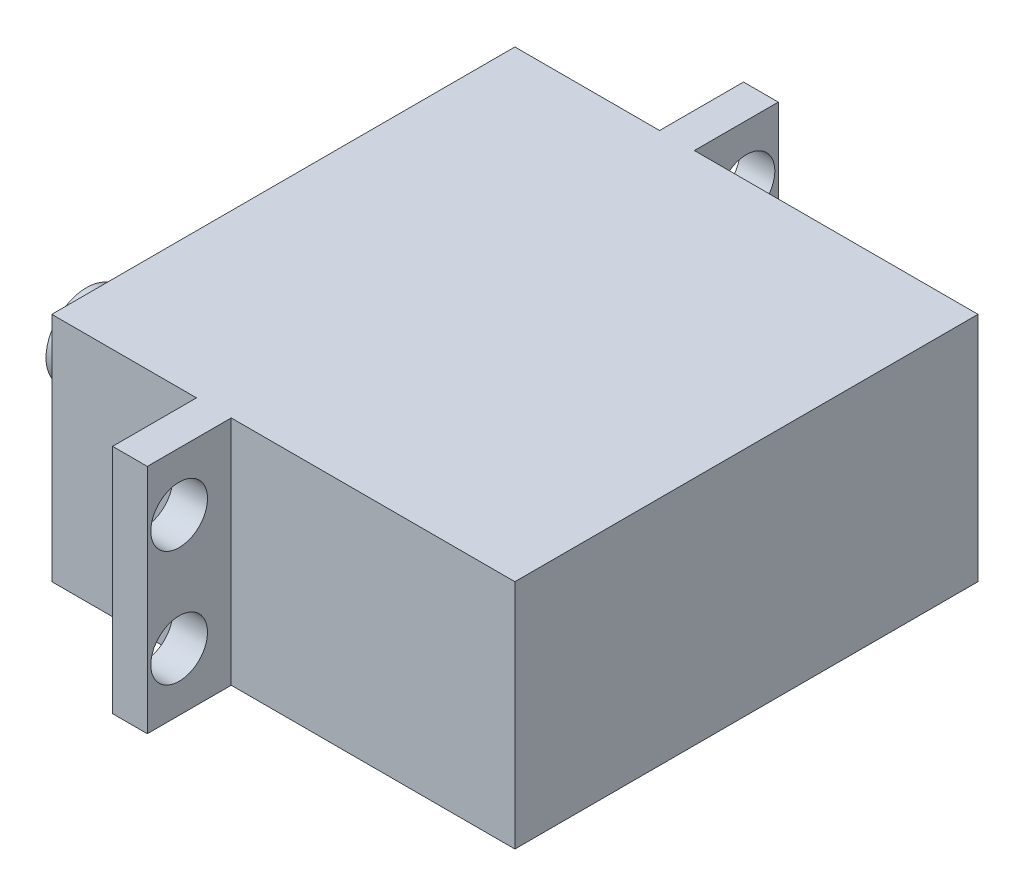
ISO-10303-21;
HEADER;
FILE_DESCRIPTION(('STEP AP214'),'2;1');
FILE_NAME('part.step','',(''),(''),'','','');
FILE_SCHEMA(('AUTOMOTIVE_DESIGN { 1 0 10303 214 1 1 1 1 }'));
ENDSEC;
DATA;
#1=APPLICATION_CONTEXT('core data for automotive mechanical design processes');
#2=APPLICATION_PROTOCOL_DEFINITION('international standard','automotive_design',2000,#1);
#3=PRODUCT_CONTEXT('',#1,'mechanical');
#4=PRODUCT('Part','Part','',(#3));
#5=PRODUCT_RELATED_PRODUCT_CATEGORY('part','',(#4));
#6=PRODUCT_DEFINITION_FORMATION('','',#4);
#7=PRODUCT_DEFINITION_CONTEXT('part definition',#1,'design');
#8=PRODUCT_DEFINITION('design','',#6,#7);
#9=PRODUCT_DEFINITION_SHAPE('','',#8);
#10=(LENGTH_UNIT() NAMED_UNIT(*) SI_UNIT(.MILLI.,.METRE.));
#11=(NAMED_UNIT(*) PLANE_ANGLE_UNIT() SI_UNIT($,.RADIAN.));
#12=(NAMED_UNIT(*) SI_UNIT($,.STERADIAN.) SOLID_ANGLE_UNIT());
#13=UNCERTAINTY_MEASURE_WITH_UNIT(LENGTH_MEASURE(1.E-05),#10,'distance_accuracy_value','');
#14=(GEOMETRIC_REPRESENTATION_CONTEXT(3) GLOBAL_UNCERTAINTY_ASSIGNED_CONTEXT((#13)) GLOBAL_UNIT_ASSIGNED_CONTEXT((#10,
#11,#12)) REPRESENTATION_CONTEXT('',''));
#15=CARTESIAN_POINT('',(0.,0.,0.));
#16=DIRECTION('',(0.,0.,1.));
#17=DIRECTION('',(1.,0.,0.));
#18=AXIS2_PLACEMENT_3D('',#15,#16,#17);
#19=CARTESIAN_POINT('',(-20.,20.,-20.));
#20=DIRECTION('',(0.,0.,1.));
#21=DIRECTION('',(1.,0.,0.));
#22=AXIS2_PLACEMENT_3D('',#19,#20,#21);
#23=PLANE('',#22);
#24=DIRECTION('',(-1.,0.,0.));
#25=VECTOR('',#24,1.);
#26=CARTESIAN_POINT('',(-20.,0.,-20.));
#27=LINE('',#26,#25);
#28=CARTESIAN_POINT('',(20.,0.,-20.));
#29=VERTEX_POINT('',#28);
#30=CARTESIAN_POINT('',(-4.5,0.,-20.));
#31=VERTEX_POINT('',#30);
#32=EDGE_CURVE('E211',#29,#31,#27,.T.);
#33=ORIENTED_EDGE('',*,*,#32,.T.);
#34=DIRECTION('',(0.,1.,0.));
#35=VECTOR('',#34,1.);
#36=CARTESIAN_POINT('',(-4.5,20.,-20.));
#37=LINE('',#36,#35);
#38=CARTESIAN_POINT('',(-4.5,20.,-20.));
#39=VERTEX_POINT('',#38);
#40=EDGE_CURVE('E134',#31,#39,#37,.T.);
#41=ORIENTED_EDGE('',*,*,#40,.T.);
#42=DIRECTION('',(-1.,0.,0.));
#43=VECTOR('',#42,1.);
#44=CARTESIAN_POINT('',(-20.,20.,-20.));
#45=LINE('',#44,#43);
#46=CARTESIAN_POINT('',(20.,20.,-20.));
#47=VERTEX_POINT('',#46);
#48=EDGE_CURVE('E200',#47,#39,#45,.T.);
#49=ORIENTED_EDGE('',*,*,#48,.F.);
#50=DIRECTION('',(0.,-1.,0.));
#51=VECTOR('',#50,1.);
#52=CARTESIAN_POINT('',(20.,20.,-20.));
#53=LINE('',#52,#51);
#54=EDGE_CURVE('E44',#47,#29,#53,.T.);
#55=ORIENTED_EDGE('',*,*,#54,.T.);
#56=EDGE_LOOP('',(#33,#41,#49,#55));
#57=FACE_BOUND('',#56,.T.);
#58=ADVANCED_FACE('F36',(#57),#23,.F.);
#59=CARTESIAN_POINT('',(-20.,20.,20.));
#60=DIRECTION('',(0.,0.,-1.));
#61=DIRECTION('',(-1.,0.,0.));
#62=AXIS2_PLACEMENT_3D('',#59,#60,#61);
#63=PLANE('',#62);
#64=DIRECTION('',(1.,0.,0.));
#65=VECTOR('',#64,1.);
#66=CARTESIAN_POINT('',(-20.,20.,20.));
#67=LINE('',#66,#65);
#68=CARTESIAN_POINT('',(-4.5,20.,20.));
#69=VERTEX_POINT('',#68);
#70=CARTESIAN_POINT('',(20.,20.,20.));
#71=VERTEX_POINT('',#70);
#72=EDGE_CURVE('E51',#69,#71,#67,.T.);
#73=ORIENTED_EDGE('',*,*,#72,.F.);
#74=DIRECTION('',(0.,-1.,0.));
#75=VECTOR('',#74,1.);
#76=CARTESIAN_POINT('',(-4.5,20.,20.));
#77=LINE('',#76,#75);
#78=CARTESIAN_POINT('',(-4.5,0.,20.));
#79=VERTEX_POINT('',#78);
#80=EDGE_CURVE('E191',#69,#79,#77,.T.);
#81=ORIENTED_EDGE('',*,*,#80,.T.);
#82=DIRECTION('',(1.,0.,0.));
#83=VECTOR('',#82,1.);
#84=CARTESIAN_POINT('',(-20.,0.,20.));
#85=LINE('',#84,#83);
#86=CARTESIAN_POINT('',(20.,0.,20.));
#87=VERTEX_POINT('',#86);
#88=EDGE_CURVE('E215',#79,#87,#85,.T.);
#89=ORIENTED_EDGE('',*,*,#88,.T.);
#90=DIRECTION('',(0.,-1.,0.));
#91=VECTOR('',#90,1.);
#92=CARTESIAN_POINT('',(20.,20.,20.));
#93=LINE('',#92,#91);
#94=EDGE_CURVE('E207',#71,#87,#93,.T.);
#95=ORIENTED_EDGE('',*,*,#94,.F.);
#96=EDGE_LOOP('',(#73,#81,#89,#95));
#97=FACE_BOUND('',#96,.T.);
#98=ADVANCED_FACE('F277',(#97),#63,.F.);
#99=CARTESIAN_POINT('',(20.,20.,-20.));
#100=DIRECTION('',(-1.,0.,0.));
#101=DIRECTION('',(0.,0.,1.));
#102=AXIS2_PLACEMENT_3D('',#99,#100,#101);
#103=PLANE('',#102);
#104=DIRECTION('',(0.,0.,-1.));
#105=VECTOR('',#104,1.);
#106=CARTESIAN_POINT('',(20.,0.,-20.));
#107=LINE('',#106,#105);
#108=EDGE_CURVE('E194',#87,#29,#107,.T.);
#109=ORIENTED_EDGE('',*,*,#108,.T.);
#110=ORIENTED_EDGE('',*,*,#54,.F.);
#111=DIRECTION('',(0.,0.,-1.));
#112=VECTOR('',#111,1.);
#113=CARTESIAN_POINT('',(20.,20.,-20.));
#114=LINE('',#113,#112);
#115=EDGE_CURVE('E195',#71,#47,#114,.T.);
#116=ORIENTED_EDGE('',*,*,#115,.F.);
#117=ORIENTED_EDGE('',*,*,#94,.T.);
#118=EDGE_LOOP('',(#109,#110,#116,#117));
#119=FACE_BOUND('',#118,.T.);
#120=ADVANCED_FACE('F38',(#119),#103,.F.);
#121=CARTESIAN_POINT('',(-7.5,20.,-20.));
#122=VERTEX_POINT('',#121);
#123=CARTESIAN_POINT('',(-20.,20.,-20.));
#124=VERTEX_POINT('',#123);
#125=EDGE_CURVE('E198',#122,#124,#45,.T.);
#126=ORIENTED_EDGE('',*,*,#125,.F.);
#127=DIRECTION('',(0.,-1.,0.));
#128=VECTOR('',#127,1.);
#129=CARTESIAN_POINT('',(-7.5,20.,-20.));
#130=LINE('',#129,#128);
#131=CARTESIAN_POINT('',(-7.5,0.,-20.));
#132=VERTEX_POINT('',#131);
#133=EDGE_CURVE('E188',#122,#132,#130,.T.);
#134=ORIENTED_EDGE('',*,*,#133,.T.);
#135=CARTESIAN_POINT('',(-20.,0.,-20.));
#136=VERTEX_POINT('',#135);
#137=EDGE_CURVE('E210',#132,#136,#27,.T.);
#138=ORIENTED_EDGE('',*,*,#137,.T.);
#139=DIRECTION('',(0.,-1.,0.));
#140=VECTOR('',#139,1.);
#141=CARTESIAN_POINT('',(-20.,20.,-20.));
#142=LINE('',#141,#140);
#143=EDGE_CURVE('E222',#124,#136,#142,.T.);
#144=ORIENTED_EDGE('',*,*,#143,.F.);
#145=EDGE_LOOP('',(#126,#134,#138,#144));
#146=FACE_BOUND('',#145,.T.);
#147=ADVANCED_FACE('F279',(#146),#23,.F.);
#148=CARTESIAN_POINT('',(-20.,20.,-20.));
#149=DIRECTION('',(1.,0.,0.));
#150=DIRECTION('',(0.,0.,-1.));
#151=AXIS2_PLACEMENT_3D('',#148,#149,#150);
#152=PLANE('',#151);
#153=CARTESIAN_POINT('',(-20.,10.,9.99999999999999));
#154=DIRECTION('',(1.,0.,0.));
#155=DIRECTION('',(0.,0.,-1.));
#156=AXIS2_PLACEMENT_3D('',#153,#154,#155);
#157=CIRCLE('',#156,5.);
#158=CARTESIAN_POINT('',(-20.,10.,4.99999999999999));
#159=VERTEX_POINT('',#158);
#160=EDGE_CURVE('E11',#159,#159,#157,.F.);
#161=ORIENTED_EDGE('',*,*,#160,.F.);
#162=EDGE_LOOP('',(#161));
#163=FACE_BOUND('',#162,.T.);
#164=DIRECTION('',(0.,0.,1.));
#165=VECTOR('',#164,1.);
#166=CARTESIAN_POINT('',(-20.,0.,-20.));
#167=LINE('',#166,#165);
#168=CARTESIAN_POINT('',(-20.,0.,20.));
#169=VERTEX_POINT('',#168);
#170=EDGE_CURVE('E213',#136,#169,#167,.T.);
#171=ORIENTED_EDGE('',*,*,#170,.T.);
#172=DIRECTION('',(0.,-1.,0.));
#173=VECTOR('',#172,1.);
#174=CARTESIAN_POINT('',(-20.,20.,20.));
#175=LINE('',#174,#173);
#176=CARTESIAN_POINT('',(-20.,20.,20.));
#177=VERTEX_POINT('',#176);
#178=EDGE_CURVE('E219',#177,#169,#175,.T.);
#179=ORIENTED_EDGE('',*,*,#178,.F.);
#180=DIRECTION('',(0.,0.,1.));
#181=VECTOR('',#180,1.);
#182=CARTESIAN_POINT('',(-20.,20.,-20.));
#183=LINE('',#182,#181);
#184=EDGE_CURVE('E203',#124,#177,#183,.T.);
#185=ORIENTED_EDGE('',*,*,#184,.F.);
#186=ORIENTED_EDGE('',*,*,#143,.T.);
#187=EDGE_LOOP('',(#171,#179,#185,#186));
#188=FACE_BOUND('',#187,.T.);
#189=ADVANCED_FACE('F287',(#163,#188),#152,.F.);
#190=CARTESIAN_POINT('',(-7.5,0.,20.));
#191=VERTEX_POINT('',#190);
#192=EDGE_CURVE('E199',#169,#191,#85,.T.);
#193=ORIENTED_EDGE('',*,*,#192,.T.);
#194=DIRECTION('',(0.,1.,0.));
#195=VECTOR('',#194,1.);
#196=CARTESIAN_POINT('',(-7.5,20.,20.));
#197=LINE('',#196,#195);
#198=CARTESIAN_POINT('',(-7.5,20.,20.));
#199=VERTEX_POINT('',#198);
#200=EDGE_CURVE('E59',#191,#199,#197,.T.);
#201=ORIENTED_EDGE('',*,*,#200,.T.);
#202=EDGE_CURVE('E205',#177,#199,#67,.T.);
#203=ORIENTED_EDGE('',*,*,#202,.F.);
#204=ORIENTED_EDGE('',*,*,#178,.T.);
#205=EDGE_LOOP('',(#193,#201,#203,#204));
#206=FACE_BOUND('',#205,.T.);
#207=ADVANCED_FACE('F284',(#206),#63,.F.);
#208=CARTESIAN_POINT('',(0.,20.,0.));
#209=DIRECTION('',(0.,1.,0.));
#210=DIRECTION('',(0.,0.,1.));
#211=AXIS2_PLACEMENT_3D('',#208,#209,#210);
#212=PLANE('',#211);
#213=ORIENTED_EDGE('',*,*,#202,.T.);
#214=DIRECTION('',(0.,0.,-1.));
#215=VECTOR('',#214,1.);
#216=CARTESIAN_POINT('',(-7.5,20.,27.25));
#217=LINE('',#216,#215);
#218=CARTESIAN_POINT('',(-7.5,20.,27.25));
#219=VERTEX_POINT('',#218);
#220=EDGE_CURVE('E179',#219,#199,#217,.T.);
#221=ORIENTED_EDGE('',*,*,#220,.F.);
#222=DIRECTION('',(1.,0.,0.));
#223=VECTOR('',#222,1.);
#224=CARTESIAN_POINT('',(-4.5,20.,27.25));
#225=LINE('',#224,#223);
#226=CARTESIAN_POINT('',(-4.5,20.,27.25));
#227=VERTEX_POINT('',#226);
#228=EDGE_CURVE('E137',#219,#227,#225,.T.);
#229=ORIENTED_EDGE('',*,*,#228,.T.);
#230=DIRECTION('',(0.,0.,-1.));
#231=VECTOR('',#230,1.);
#232=CARTESIAN_POINT('',(-4.5,20.,27.25));
#233=LINE('',#232,#231);
#234=EDGE_CURVE('E175',#227,#69,#233,.T.);
#235=ORIENTED_EDGE('',*,*,#234,.T.);
#236=ORIENTED_EDGE('',*,*,#72,.T.);
#237=ORIENTED_EDGE('',*,*,#115,.T.);
#238=ORIENTED_EDGE('',*,*,#48,.T.);
#239=CARTESIAN_POINT('',(-4.5,20.,-27.25));
#240=VERTEX_POINT('',#239);
#241=EDGE_CURVE('E178',#39,#240,#233,.T.);
#242=ORIENTED_EDGE('',*,*,#241,.T.);
#243=DIRECTION('',(1.,0.,0.));
#244=VECTOR('',#243,1.);
#245=CARTESIAN_POINT('',(-4.5,20.,-27.25));
#246=LINE('',#245,#244);
#247=CARTESIAN_POINT('',(-7.5,20.,-27.25));
#248=VERTEX_POINT('',#247);
#249=EDGE_CURVE('E152',#248,#240,#246,.T.);
#250=ORIENTED_EDGE('',*,*,#249,.F.);
#251=EDGE_CURVE('E182',#122,#248,#217,.T.);
#252=ORIENTED_EDGE('',*,*,#251,.F.);
#253=ORIENTED_EDGE('',*,*,#125,.T.);
#254=ORIENTED_EDGE('',*,*,#184,.T.);
#255=EDGE_LOOP('',(#213,#221,#229,#235,#236,#237,#238,#242,#250,#252,#253,#254));
#256=FACE_BOUND('',#255,.T.);
#257=ADVANCED_FACE('F301',(#256),#212,.T.);
#258=CARTESIAN_POINT('',(0.,0.,0.));
#259=DIRECTION('',(0.,1.,0.));
#260=DIRECTION('',(0.,0.,1.));
#261=AXIS2_PLACEMENT_3D('',#258,#259,#260);
#262=PLANE('',#261);
#263=ORIENTED_EDGE('',*,*,#137,.F.);
#264=DIRECTION('',(0.,0.,-1.));
#265=VECTOR('',#264,1.);
#266=CARTESIAN_POINT('',(-7.5,0.,27.25));
#267=LINE('',#266,#265);
#268=CARTESIAN_POINT('',(-7.5,0.,-27.25));
#269=VERTEX_POINT('',#268);
#270=EDGE_CURVE('E143',#132,#269,#267,.T.);
#271=ORIENTED_EDGE('',*,*,#270,.T.);
#272=DIRECTION('',(-1.,0.,0.));
#273=VECTOR('',#272,1.);
#274=CARTESIAN_POINT('',(-4.5,0.,-27.25));
#275=LINE('',#274,#273);
#276=CARTESIAN_POINT('',(-4.5,0.,-27.25));
#277=VERTEX_POINT('',#276);
#278=EDGE_CURVE('E140',#277,#269,#275,.T.);
#279=ORIENTED_EDGE('',*,*,#278,.F.);
#280=DIRECTION('',(0.,0.,-1.));
#281=VECTOR('',#280,1.);
#282=CARTESIAN_POINT('',(-4.5,0.,27.25));
#283=LINE('',#282,#281);
#284=EDGE_CURVE('E128',#31,#277,#283,.T.);
#285=ORIENTED_EDGE('',*,*,#284,.F.);
#286=ORIENTED_EDGE('',*,*,#32,.F.);
#287=ORIENTED_EDGE('',*,*,#108,.F.);
#288=ORIENTED_EDGE('',*,*,#88,.F.);
#289=CARTESIAN_POINT('',(-4.5,0.,27.25));
#290=VERTEX_POINT('',#289);
#291=EDGE_CURVE('E136',#290,#79,#283,.T.);
#292=ORIENTED_EDGE('',*,*,#291,.F.);
#293=DIRECTION('',(-1.,0.,0.));
#294=VECTOR('',#293,1.);
#295=CARTESIAN_POINT('',(-4.5,0.,27.25));
#296=LINE('',#295,#294);
#297=CARTESIAN_POINT('',(-7.5,0.,27.25));
#298=VERTEX_POINT('',#297);
#299=EDGE_CURVE('E167',#290,#298,#296,.T.);
#300=ORIENTED_EDGE('',*,*,#299,.T.);
#301=EDGE_CURVE('E183',#298,#191,#267,.T.);
#302=ORIENTED_EDGE('',*,*,#301,.T.);
#303=ORIENTED_EDGE('',*,*,#192,.F.);
#304=ORIENTED_EDGE('',*,*,#170,.F.);
#305=EDGE_LOOP('',(#263,#271,#279,#285,#286,#287,#288,#292,#300,#302,#303,#304));
#306=FACE_BOUND('',#305,.T.);
#307=ADVANCED_FACE('F141',(#306),#262,.F.);
#308=CARTESIAN_POINT('',(0.,0.,27.25));
#309=DIRECTION('',(0.,0.,-1.));
#310=DIRECTION('',(-1.,0.,0.));
#311=AXIS2_PLACEMENT_3D('',#308,#309,#310);
#312=PLANE('',#311);
#313=DIRECTION('',(0.,-1.,0.));
#314=VECTOR('',#313,1.);
#315=CARTESIAN_POINT('',(-4.5,20.,27.25));
#316=LINE('',#315,#314);
#317=EDGE_CURVE('E164',#227,#290,#316,.T.);
#318=ORIENTED_EDGE('',*,*,#317,.F.);
#319=ORIENTED_EDGE('',*,*,#228,.F.);
#320=DIRECTION('',(0.,1.,0.));
#321=VECTOR('',#320,1.);
#322=CARTESIAN_POINT('',(-7.5,20.,27.25));
#323=LINE('',#322,#321);
#324=EDGE_CURVE('E170',#298,#219,#323,.T.);
#325=ORIENTED_EDGE('',*,*,#324,.F.);
#326=ORIENTED_EDGE('',*,*,#299,.F.);
#327=EDGE_LOOP('',(#318,#319,#325,#326));
#328=FACE_BOUND('',#327,.T.);
#329=ADVANCED_FACE('F310',(#328),#312,.F.);
#330=CARTESIAN_POINT('',(-7.5,20.,27.25));
#331=DIRECTION('',(-1.,0.,0.));
#332=DIRECTION('',(0.,0.,1.));
#333=AXIS2_PLACEMENT_3D('',#330,#331,#332);
#334=PLANE('',#333);
#335=CARTESIAN_POINT('',(-7.5,5.,24.5));
#336=DIRECTION('',(-1.,0.,0.));
#337=DIRECTION('',(0.,0.,1.));
#338=AXIS2_PLACEMENT_3D('',#335,#336,#337);
#339=CIRCLE('',#338,2.45);
#340=CARTESIAN_POINT('',(-7.5,5.,26.95));
#341=VERTEX_POINT('',#340);
#342=EDGE_CURVE('E246',#341,#341,#339,.T.);
#343=ORIENTED_EDGE('',*,*,#342,.F.);
#344=EDGE_LOOP('',(#343));
#345=FACE_BOUND('',#344,.T.);
#346=CARTESIAN_POINT('',(-7.5,15.,24.5));
#347=DIRECTION('',(-1.,0.,0.));
#348=DIRECTION('',(0.,0.,-1.));
#349=AXIS2_PLACEMENT_3D('',#346,#347,#348);
#350=CIRCLE('',#349,2.45);
#351=CARTESIAN_POINT('',(-7.5,15.,26.95));
#352=VERTEX_POINT('',#351);
#353=EDGE_CURVE('E242',#352,#352,#350,.T.);
#354=ORIENTED_EDGE('',*,*,#353,.F.);
#355=EDGE_LOOP('',(#354));
#356=FACE_BOUND('',#355,.T.);
#357=ORIENTED_EDGE('',*,*,#200,.F.);
#358=ORIENTED_EDGE('',*,*,#301,.F.);
#359=ORIENTED_EDGE('',*,*,#324,.T.);
#360=ORIENTED_EDGE('',*,*,#220,.T.);
#361=EDGE_LOOP('',(#357,#358,#359,#360));
#362=FACE_BOUND('',#361,.T.);
#363=ADVANCED_FACE('F273',(#345,#356,#362),#334,.T.);
#364=CARTESIAN_POINT('',(-4.5,20.,27.25));
#365=DIRECTION('',(1.,0.,0.));
#366=DIRECTION('',(0.,0.,-1.));
#367=AXIS2_PLACEMENT_3D('',#364,#365,#366);
#368=PLANE('',#367);
#369=CARTESIAN_POINT('',(-4.5,5.,24.5));
#370=DIRECTION('',(1.,0.,0.));
#371=DIRECTION('',(0.,0.,-1.));
#372=AXIS2_PLACEMENT_3D('',#369,#370,#371);
#373=CIRCLE('',#372,2.45);
#374=CARTESIAN_POINT('',(-4.5,5.,26.95));
#375=VERTEX_POINT('',#374);
#376=EDGE_CURVE('E153',#375,#375,#373,.T.);
#377=ORIENTED_EDGE('',*,*,#376,.F.);
#378=EDGE_LOOP('',(#377));
#379=FACE_BOUND('',#378,.T.);
#380=CARTESIAN_POINT('',(-4.5,15.,24.5));
#381=DIRECTION('',(1.,0.,0.));
#382=DIRECTION('',(0.,0.,-1.));
#383=AXIS2_PLACEMENT_3D('',#380,#381,#382);
#384=CIRCLE('',#383,2.45);
#385=CARTESIAN_POINT('',(-4.5,15.,26.95));
#386=VERTEX_POINT('',#385);
#387=EDGE_CURVE('E156',#386,#386,#384,.T.);
#388=ORIENTED_EDGE('',*,*,#387,.F.);
#389=EDGE_LOOP('',(#388));
#390=FACE_BOUND('',#389,.T.);
#391=ORIENTED_EDGE('',*,*,#80,.F.);
#392=ORIENTED_EDGE('',*,*,#234,.F.);
#393=ORIENTED_EDGE('',*,*,#317,.T.);
#394=ORIENTED_EDGE('',*,*,#291,.T.);
#395=EDGE_LOOP('',(#391,#392,#393,#394));
#396=FACE_BOUND('',#395,.T.);
#397=ADVANCED_FACE('F265',(#379,#390,#396),#368,.T.);
#398=CARTESIAN_POINT('',(-4.5,5.,-24.5));
#399=DIRECTION('',(1.,0.,0.));
#400=DIRECTION('',(0.,0.,-1.));
#401=AXIS2_PLACEMENT_3D('',#398,#399,#400);
#402=CIRCLE('',#401,2.45);
#403=CARTESIAN_POINT('',(-4.5,5.,-22.05));
#404=VERTEX_POINT('',#403);
#405=EDGE_CURVE('E159',#404,#404,#402,.T.);
#406=ORIENTED_EDGE('',*,*,#405,.F.);
#407=EDGE_LOOP('',(#406));
#408=FACE_BOUND('',#407,.T.);
#409=CARTESIAN_POINT('',(-4.5,15.,-24.5));
#410=DIRECTION('',(1.,0.,0.));
#411=DIRECTION('',(0.,0.,-1.));
#412=AXIS2_PLACEMENT_3D('',#409,#410,#411);
#413=CIRCLE('',#412,2.45);
#414=CARTESIAN_POINT('',(-4.5,15.,-22.05));
#415=VERTEX_POINT('',#414);
#416=EDGE_CURVE('E252',#415,#415,#413,.T.);
#417=ORIENTED_EDGE('',*,*,#416,.F.);
#418=EDGE_LOOP('',(#417));
#419=FACE_BOUND('',#418,.T.);
#420=ORIENTED_EDGE('',*,*,#40,.F.);
#421=ORIENTED_EDGE('',*,*,#284,.T.);
#422=DIRECTION('',(0.,-1.,0.));
#423=VECTOR('',#422,1.);
#424=CARTESIAN_POINT('',(-4.5,20.,-27.25));
#425=LINE('',#424,#423);
#426=EDGE_CURVE('E133',#240,#277,#425,.T.);
#427=ORIENTED_EDGE('',*,*,#426,.F.);
#428=ORIENTED_EDGE('',*,*,#241,.F.);
#429=EDGE_LOOP('',(#420,#421,#427,#428));
#430=FACE_BOUND('',#429,.T.);
#431=ADVANCED_FACE('F130',(#408,#419,#430),#368,.T.);
#432=CARTESIAN_POINT('',(-7.5,5.,-24.5));
#433=DIRECTION('',(-1.,0.,0.));
#434=DIRECTION('',(0.,0.,-1.));
#435=AXIS2_PLACEMENT_3D('',#432,#433,#434);
#436=CIRCLE('',#435,2.45);
#437=CARTESIAN_POINT('',(-7.5,5.,-22.05));
#438=VERTEX_POINT('',#437);
#439=EDGE_CURVE('E235',#438,#438,#436,.T.);
#440=ORIENTED_EDGE('',*,*,#439,.F.);
#441=EDGE_LOOP('',(#440));
#442=FACE_BOUND('',#441,.T.);
#443=CARTESIAN_POINT('',(-7.5,15.,-24.5));
#444=DIRECTION('',(-1.,0.,0.));
#445=DIRECTION('',(0.,0.,1.));
#446=AXIS2_PLACEMENT_3D('',#443,#444,#445);
#447=CIRCLE('',#446,2.45);
#448=CARTESIAN_POINT('',(-7.5,15.,-22.05));
#449=VERTEX_POINT('',#448);
#450=EDGE_CURVE('E245',#449,#449,#447,.T.);
#451=ORIENTED_EDGE('',*,*,#450,.F.);
#452=EDGE_LOOP('',(#451));
#453=FACE_BOUND('',#452,.T.);
#454=ORIENTED_EDGE('',*,*,#133,.F.);
#455=ORIENTED_EDGE('',*,*,#251,.T.);
#456=DIRECTION('',(0.,1.,0.));
#457=VECTOR('',#456,1.);
#458=CARTESIAN_POINT('',(-7.5,20.,-27.25));
#459=LINE('',#458,#457);
#460=EDGE_CURVE('E147',#269,#248,#459,.T.);
#461=ORIENTED_EDGE('',*,*,#460,.F.);
#462=ORIENTED_EDGE('',*,*,#270,.F.);
#463=EDGE_LOOP('',(#454,#455,#461,#462));
#464=FACE_BOUND('',#463,.T.);
#465=ADVANCED_FACE('F264',(#442,#453,#464),#334,.T.);
#466=CARTESIAN_POINT('',(0.,0.,-27.25));
#467=DIRECTION('',(0.,0.,-1.));
#468=DIRECTION('',(-1.,0.,0.));
#469=AXIS2_PLACEMENT_3D('',#466,#467,#468);
#470=PLANE('',#469);
#471=ORIENTED_EDGE('',*,*,#426,.T.);
#472=ORIENTED_EDGE('',*,*,#278,.T.);
#473=ORIENTED_EDGE('',*,*,#460,.T.);
#474=ORIENTED_EDGE('',*,*,#249,.T.);
#475=EDGE_LOOP('',(#471,#472,#473,#474));
#476=FACE_BOUND('',#475,.T.);
#477=ADVANCED_FACE('F150',(#476),#470,.T.);
#478=CARTESIAN_POINT('',(-0.25,15.,-24.5));
#479=DIRECTION('',(-1.,0.,0.));
#480=DIRECTION('',(0.,0.,1.));
#481=AXIS2_PLACEMENT_3D('',#478,#479,#480);
#482=CYLINDRICAL_SURFACE('',#481,2.45);
#483=CARTESIAN_POINT('',(-4.5,15.,-22.05));
#484=CARTESIAN_POINT('',(-4.53125,15.,-22.05));
#485=CARTESIAN_POINT('',(-4.5625,15.,-22.05));
#486=CARTESIAN_POINT('',(-4.625,15.,-22.05));
#487=CARTESIAN_POINT('',(-4.65625,15.,-22.05));
#488=CARTESIAN_POINT('',(-4.71875,15.,-22.05));
#489=CARTESIAN_POINT('',(-4.75,15.,-22.05));
#490=CARTESIAN_POINT('',(-4.8125,15.,-22.05));
#491=CARTESIAN_POINT('',(-4.84375,15.,-22.05));
#492=CARTESIAN_POINT('',(-4.90625,15.,-22.05));
#493=CARTESIAN_POINT('',(-4.9375,15.,-22.05));
#494=CARTESIAN_POINT('',(-5.,15.,-22.05));
#495=CARTESIAN_POINT('',(-5.03125,15.,-22.05));
#496=CARTESIAN_POINT('',(-5.09375,15.,-22.05));
#497=CARTESIAN_POINT('',(-5.125,15.,-22.05));
#498=CARTESIAN_POINT('',(-5.1875,15.,-22.05));
#499=CARTESIAN_POINT('',(-5.21875,15.,-22.05));
#500=CARTESIAN_POINT('',(-5.28125,15.,-22.05));
#501=CARTESIAN_POINT('',(-5.3125,15.,-22.05));
#502=CARTESIAN_POINT('',(-5.375,15.,-22.05));
#503=CARTESIAN_POINT('',(-5.40625,15.,-22.05));
#504=CARTESIAN_POINT('',(-5.46875,15.,-22.05));
#505=CARTESIAN_POINT('',(-5.5,15.,-22.05));
#506=CARTESIAN_POINT('',(-5.5625,15.,-22.05));
#507=CARTESIAN_POINT('',(-5.59375,15.,-22.05));
#508=CARTESIAN_POINT('',(-5.65625,15.,-22.05));
#509=CARTESIAN_POINT('',(-5.6875,15.,-22.05));
#510=CARTESIAN_POINT('',(-5.75,15.,-22.05));
#511=CARTESIAN_POINT('',(-5.78125,15.,-22.05));
#512=CARTESIAN_POINT('',(-5.84375,15.,-22.05));
#513=CARTESIAN_POINT('',(-5.875,15.,-22.05));
#514=CARTESIAN_POINT('',(-5.9375,15.,-22.05));
#515=CARTESIAN_POINT('',(-5.96875,15.,-22.05));
#516=CARTESIAN_POINT('',(-6.03125,15.,-22.05));
#517=CARTESIAN_POINT('',(-6.0625,15.,-22.05));
#518=CARTESIAN_POINT('',(-6.125,15.,-22.05));
#519=CARTESIAN_POINT('',(-6.15625,15.,-22.05));
#520=CARTESIAN_POINT('',(-6.21875,15.,-22.05));
#521=CARTESIAN_POINT('',(-6.25,15.,-22.05));
#522=CARTESIAN_POINT('',(-6.3125,15.,-22.05));
#523=CARTESIAN_POINT('',(-6.34375,15.,-22.05));
#524=CARTESIAN_POINT('',(-6.40625,15.,-22.05));
#525=CARTESIAN_POINT('',(-6.4375,15.,-22.05));
#526=CARTESIAN_POINT('',(-6.5,15.,-22.05));
#527=CARTESIAN_POINT('',(-6.53125,15.,-22.05));
#528=CARTESIAN_POINT('',(-6.59375,15.,-22.05));
#529=CARTESIAN_POINT('',(-6.625,15.,-22.05));
#530=CARTESIAN_POINT('',(-6.6875,15.,-22.05));
#531=CARTESIAN_POINT('',(-6.71875,15.,-22.05));
#532=CARTESIAN_POINT('',(-6.78125,15.,-22.05));
#533=CARTESIAN_POINT('',(-6.8125,15.,-22.05));
#534=CARTESIAN_POINT('',(-6.875,15.,-22.05));
#535=CARTESIAN_POINT('',(-6.90625,15.,-22.05));
#536=CARTESIAN_POINT('',(-6.96875,15.,-22.05));
#537=CARTESIAN_POINT('',(-7.,15.,-22.05));
#538=CARTESIAN_POINT('',(-7.0625,15.,-22.05));
#539=CARTESIAN_POINT('',(-7.09375,15.,-22.05));
#540=CARTESIAN_POINT('',(-7.15625,15.,-22.05));
#541=CARTESIAN_POINT('',(-7.1875,15.,-22.05));
#542=CARTESIAN_POINT('',(-7.25,15.,-22.05));
#543=CARTESIAN_POINT('',(-7.28125,15.,-22.05));
#544=CARTESIAN_POINT('',(-7.34375,15.,-22.05));
#545=CARTESIAN_POINT('',(-7.375,15.,-22.05));
#546=CARTESIAN_POINT('',(-7.4375,15.,-22.05));
#547=CARTESIAN_POINT('',(-7.46875,15.,-22.05));
#548=CARTESIAN_POINT('',(-7.5,15.,-22.05));
#549=B_SPLINE_CURVE_WITH_KNOTS('',3,(#483,#484,#485,#486,#487,#488,#489,#490,#491,#492,#493,
#494,#495,#496,#497,#498,#499,#500,#501,#502,#503,#504,#505,#506,#507,#508,#509,#510,#511,#512,
#513,#514,#515,#516,#517,#518,#519,#520,#521,#522,#523,#524,#525,#526,#527,#528,#529,#530,#531,
#532,#533,#534,#535,#536,#537,#538,#539,#540,#541,#542,#543,#544,#545,#546,#547,#548),
.UNSPECIFIED.,.F.,.F.,(4,2,2,2,2,2,2,2,2,2,2,2,2,2,2,2,2,2,2,2,2,2,2,2,2,2,2,2,2,2,2,2,4),(0.,
0.0937500000000001,0.1875,0.28125,0.375,0.46875,0.5625,0.65625,0.75,0.84375,0.9375,1.03125,
1.125,1.21875,1.3125,1.40625,1.5,1.59375,1.6875,1.78125,1.875,1.96875,2.0625,2.15625,2.25,
2.34375,2.4375,2.53125,2.625,2.71875,2.8125,2.90625,3.),.UNSPECIFIED.);
#550=EDGE_CURVE('BSEAM334',#415,#449,#549,.T.);
#551=ORIENTED_EDGE('',*,*,#416,.T.);
#552=ORIENTED_EDGE('',*,*,#450,.T.);
#553=ORIENTED_EDGE('',*,*,#550,.T.);
#554=ORIENTED_EDGE('',*,*,#550,.F.);
#555=EDGE_LOOP('',(#551,#553,#552,#554));
#556=FACE_BOUND('',#555,.T.);
#557=ADVANCED_FACE('F334',(#556),#482,.F.);
#558=CARTESIAN_POINT('',(-0.25,5.,-24.5));
#559=DIRECTION('',(-1.,0.,0.));
#560=DIRECTION('',(0.,0.,1.));
#561=AXIS2_PLACEMENT_3D('',#558,#559,#560);
#562=CYLINDRICAL_SURFACE('',#561,2.45);
#563=CARTESIAN_POINT('',(-4.5,5.,-22.05));
#564=CARTESIAN_POINT('',(-4.53125,5.,-22.05));
#565=CARTESIAN_POINT('',(-4.5625,5.,-22.05));
#566=CARTESIAN_POINT('',(-4.625,5.,-22.05));
#567=CARTESIAN_POINT('',(-4.65625,5.,-22.05));
#568=CARTESIAN_POINT('',(-4.71875,5.,-22.05));
#569=CARTESIAN_POINT('',(-4.75,5.,-22.05));
#570=CARTESIAN_POINT('',(-4.8125,5.,-22.05));
#571=CARTESIAN_POINT('',(-4.84375,5.,-22.05));
#572=CARTESIAN_POINT('',(-4.90625,5.,-22.05));
#573=CARTESIAN_POINT('',(-4.9375,5.,-22.05));
#574=CARTESIAN_POINT('',(-5.,5.,-22.05));
#575=CARTESIAN_POINT('',(-5.03125,5.,-22.05));
#576=CARTESIAN_POINT('',(-5.09375,5.,-22.05));
#577=CARTESIAN_POINT('',(-5.125,5.,-22.05));
#578=CARTESIAN_POINT('',(-5.1875,5.,-22.05));
#579=CARTESIAN_POINT('',(-5.21875,5.,-22.05));
#580=CARTESIAN_POINT('',(-5.28125,5.,-22.05));
#581=CARTESIAN_POINT('',(-5.3125,5.,-22.05));
#582=CARTESIAN_POINT('',(-5.375,5.,-22.05));
#583=CARTESIAN_POINT('',(-5.40625,5.,-22.05));
#584=CARTESIAN_POINT('',(-5.46875,5.,-22.05));
#585=CARTESIAN_POINT('',(-5.5,5.,-22.05));
#586=CARTESIAN_POINT('',(-5.5625,5.,-22.05));
#587=CARTESIAN_POINT('',(-5.59375,5.,-22.05));
#588=CARTESIAN_POINT('',(-5.65625,5.,-22.05));
#589=CARTESIAN_POINT('',(-5.6875,5.,-22.05));
#590=CARTESIAN_POINT('',(-5.75,5.,-22.05));
#591=CARTESIAN_POINT('',(-5.78125,5.,-22.05));
#592=CARTESIAN_POINT('',(-5.84375,5.,-22.05));
#593=CARTESIAN_POINT('',(-5.875,5.,-22.05));
#594=CARTESIAN_POINT('',(-5.9375,5.,-22.05));
#595=CARTESIAN_POINT('',(-5.96875,5.,-22.05));
#596=CARTESIAN_POINT('',(-6.03125,5.,-22.05));
#597=CARTESIAN_POINT('',(-6.0625,5.,-22.05));
#598=CARTESIAN_POINT('',(-6.125,5.,-22.05));
#599=CARTESIAN_POINT('',(-6.15625,5.,-22.05));
#600=CARTESIAN_POINT('',(-6.21875,5.,-22.05));
#601=CARTESIAN_POINT('',(-6.25,5.,-22.05));
#602=CARTESIAN_POINT('',(-6.3125,5.,-22.05));
#603=CARTESIAN_POINT('',(-6.34375,5.,-22.05));
#604=CARTESIAN_POINT('',(-6.40625,5.,-22.05));
#605=CARTESIAN_POINT('',(-6.4375,5.,-22.05));
#606=CARTESIAN_POINT('',(-6.5,5.,-22.05));
#607=CARTESIAN_POINT('',(-6.53125,5.,-22.05));
#608=CARTESIAN_POINT('',(-6.59375,5.,-22.05));
#609=CARTESIAN_POINT('',(-6.625,5.,-22.05));
#610=CARTESIAN_POINT('',(-6.6875,5.,-22.05));
#611=CARTESIAN_POINT('',(-6.71875,5.,-22.05));
#612=CARTESIAN_POINT('',(-6.78125,5.,-22.05));
#613=CARTESIAN_POINT('',(-6.8125,5.,-22.05));
#614=CARTESIAN_POINT('',(-6.875,5.,-22.05));
#615=CARTESIAN_POINT('',(-6.90625,5.,-22.05));
#616=CARTESIAN_POINT('',(-6.96875,5.,-22.05));
#617=CARTESIAN_POINT('',(-7.,5.,-22.05));
#618=CARTESIAN_POINT('',(-7.0625,5.,-22.05));
#619=CARTESIAN_POINT('',(-7.09375,5.,-22.05));
#620=CARTESIAN_POINT('',(-7.15625,5.,-22.05));
#621=CARTESIAN_POINT('',(-7.1875,5.,-22.05));
#622=CARTESIAN_POINT('',(-7.25,5.,-22.05));
#623=CARTESIAN_POINT('',(-7.28125,5.,-22.05));
#624=CARTESIAN_POINT('',(-7.34375,5.,-22.05));
#625=CARTESIAN_POINT('',(-7.375,5.,-22.05));
#626=CARTESIAN_POINT('',(-7.4375,5.,-22.05));
#627=CARTESIAN_POINT('',(-7.46875,5.,-22.05));
#628=CARTESIAN_POINT('',(-7.5,5.,-22.05));
#629=B_SPLINE_CURVE_WITH_KNOTS('',3,(#563,#564,#565,#566,#567,#568,#569,#570,#571,#572,#573,
#574,#575,#576,#577,#578,#579,#580,#581,#582,#583,#584,#585,#586,#587,#588,#589,#590,#591,#592,
#593,#594,#595,#596,#597,#598,#599,#600,#601,#602,#603,#604,#605,#606,#607,#608,#609,#610,#611,
#612,#613,#614,#615,#616,#617,#618,#619,#620,#621,#622,#623,#624,#625,#626,#627,#628),
.UNSPECIFIED.,.F.,.F.,(4,2,2,2,2,2,2,2,2,2,2,2,2,2,2,2,2,2,2,2,2,2,2,2,2,2,2,2,2,2,2,2,4),(0.,
0.0937500000000001,0.1875,0.28125,0.375,0.46875,0.5625,0.65625,0.75,0.84375,0.9375,1.03125,
1.125,1.21875,1.3125,1.40625,1.5,1.59375,1.6875,1.78125,1.875,1.96875,2.0625,2.15625,2.25,
2.34375,2.4375,2.53125,2.625,2.71875,2.8125,2.90625,3.),.UNSPECIFIED.);
#630=EDGE_CURVE('BSEAM259',#404,#438,#629,.T.);
#631=ORIENTED_EDGE('',*,*,#405,.T.);
#632=ORIENTED_EDGE('',*,*,#439,.T.);
#633=ORIENTED_EDGE('',*,*,#630,.T.);
#634=ORIENTED_EDGE('',*,*,#630,.F.);
#635=EDGE_LOOP('',(#631,#633,#632,#634));
#636=FACE_BOUND('',#635,.T.);
#637=ADVANCED_FACE('F259',(#636),#562,.F.);
#638=CARTESIAN_POINT('',(-0.25,15.,24.5));
#639=DIRECTION('',(-1.,0.,0.));
#640=DIRECTION('',(0.,0.,1.));
#641=AXIS2_PLACEMENT_3D('',#638,#639,#640);
#642=CYLINDRICAL_SURFACE('',#641,2.45);
#643=CARTESIAN_POINT('',(-4.5,15.,26.95));
#644=CARTESIAN_POINT('',(-4.53125,15.,26.95));
#645=CARTESIAN_POINT('',(-4.5625,15.,26.95));
#646=CARTESIAN_POINT('',(-4.625,15.,26.95));
#647=CARTESIAN_POINT('',(-4.65625,15.,26.95));
#648=CARTESIAN_POINT('',(-4.71875,15.,26.95));
#649=CARTESIAN_POINT('',(-4.75,15.,26.95));
#650=CARTESIAN_POINT('',(-4.8125,15.,26.95));
#651=CARTESIAN_POINT('',(-4.84375,15.,26.95));
#652=CARTESIAN_POINT('',(-4.90625,15.,26.95));
#653=CARTESIAN_POINT('',(-4.9375,15.,26.95));
#654=CARTESIAN_POINT('',(-5.,15.,26.95));
#655=CARTESIAN_POINT('',(-5.03125,15.,26.95));
#656=CARTESIAN_POINT('',(-5.09375,15.,26.95));
#657=CARTESIAN_POINT('',(-5.125,15.,26.95));
#658=CARTESIAN_POINT('',(-5.1875,15.,26.95));
#659=CARTESIAN_POINT('',(-5.21875,15.,26.95));
#660=CARTESIAN_POINT('',(-5.28125,15.,26.95));
#661=CARTESIAN_POINT('',(-5.3125,15.,26.95));
#662=CARTESIAN_POINT('',(-5.375,15.,26.95));
#663=CARTESIAN_POINT('',(-5.40625,15.,26.95));
#664=CARTESIAN_POINT('',(-5.46875,15.,26.95));
#665=CARTESIAN_POINT('',(-5.5,15.,26.95));
#666=CARTESIAN_POINT('',(-5.5625,15.,26.95));
#667=CARTESIAN_POINT('',(-5.59375,15.,26.95));
#668=CARTESIAN_POINT('',(-5.65625,15.,26.95));
#669=CARTESIAN_POINT('',(-5.6875,15.,26.95));
#670=CARTESIAN_POINT('',(-5.75,15.,26.95));
#671=CARTESIAN_POINT('',(-5.78125,15.,26.95));
#672=CARTESIAN_POINT('',(-5.84375,15.,26.95));
#673=CARTESIAN_POINT('',(-5.875,15.,26.95));
#674=CARTESIAN_POINT('',(-5.9375,15.,26.95));
#675=CARTESIAN_POINT('',(-5.96875,15.,26.95));
#676=CARTESIAN_POINT('',(-6.03125,15.,26.95));
#677=CARTESIAN_POINT('',(-6.0625,15.,26.95));
#678=CARTESIAN_POINT('',(-6.125,15.,26.95));
#679=CARTESIAN_POINT('',(-6.15625,15.,26.95));
#680=CARTESIAN_POINT('',(-6.21875,15.,26.95));
#681=CARTESIAN_POINT('',(-6.25,15.,26.95));
#682=CARTESIAN_POINT('',(-6.3125,15.,26.95));
#683=CARTESIAN_POINT('',(-6.34375,15.,26.95));
#684=CARTESIAN_POINT('',(-6.40625,15.,26.95));
#685=CARTESIAN_POINT('',(-6.4375,15.,26.95));
#686=CARTESIAN_POINT('',(-6.5,15.,26.95));
#687=CARTESIAN_POINT('',(-6.53125,15.,26.95));
#688=CARTESIAN_POINT('',(-6.59375,15.,26.95));
#689=CARTESIAN_POINT('',(-6.625,15.,26.95));
#690=CARTESIAN_POINT('',(-6.6875,15.,26.95));
#691=CARTESIAN_POINT('',(-6.71875,15.,26.95));
#692=CARTESIAN_POINT('',(-6.78125,15.,26.95));
#693=CARTESIAN_POINT('',(-6.8125,15.,26.95));
#694=CARTESIAN_POINT('',(-6.875,15.,26.95));
#695=CARTESIAN_POINT('',(-6.90625,15.,26.95));
#696=CARTESIAN_POINT('',(-6.96875,15.,26.95));
#697=CARTESIAN_POINT('',(-7.,15.,26.95));
#698=CARTESIAN_POINT('',(-7.0625,15.,26.95));
#699=CARTESIAN_POINT('',(-7.09375,15.,26.95));
#700=CARTESIAN_POINT('',(-7.15625,15.,26.95));
#701=CARTESIAN_POINT('',(-7.1875,15.,26.95));
#702=CARTESIAN_POINT('',(-7.25,15.,26.95));
#703=CARTESIAN_POINT('',(-7.28125,15.,26.95));
#704=CARTESIAN_POINT('',(-7.34375,15.,26.95));
#705=CARTESIAN_POINT('',(-7.375,15.,26.95));
#706=CARTESIAN_POINT('',(-7.4375,15.,26.95));
#707=CARTESIAN_POINT('',(-7.46875,15.,26.95));
#708=CARTESIAN_POINT('',(-7.5,15.,26.95));
#709=B_SPLINE_CURVE_WITH_KNOTS('',3,(#643,#644,#645,#646,#647,#648,#649,#650,#651,#652,#653,
#654,#655,#656,#657,#658,#659,#660,#661,#662,#663,#664,#665,#666,#667,#668,#669,#670,#671,#672,
#673,#674,#675,#676,#677,#678,#679,#680,#681,#682,#683,#684,#685,#686,#687,#688,#689,#690,#691,
#692,#693,#694,#695,#696,#697,#698,#699,#700,#701,#702,#703,#704,#705,#706,#707,#708),
.UNSPECIFIED.,.F.,.F.,(4,2,2,2,2,2,2,2,2,2,2,2,2,2,2,2,2,2,2,2,2,2,2,2,2,2,2,2,2,2,2,2,4),(0.,
0.0937500000000001,0.1875,0.28125,0.375,0.46875,0.5625,0.65625,0.75,0.84375,0.9375,1.03125,
1.125,1.21875,1.3125,1.40625,1.5,1.59375,1.6875,1.78125,1.875,1.96875,2.0625,2.15625,2.25,
2.34375,2.4375,2.53125,2.625,2.71875,2.8125,2.90625,3.),.UNSPECIFIED.);
#710=EDGE_CURVE('BSEAM339',#386,#352,#709,.T.);
#711=ORIENTED_EDGE('',*,*,#387,.T.);
#712=ORIENTED_EDGE('',*,*,#353,.T.);
#713=ORIENTED_EDGE('',*,*,#710,.T.);
#714=ORIENTED_EDGE('',*,*,#710,.F.);
#715=EDGE_LOOP('',(#711,#713,#712,#714));
#716=FACE_BOUND('',#715,.T.);
#717=ADVANCED_FACE('F339',(#716),#642,.F.);
#718=CARTESIAN_POINT('',(-0.25,5.,24.5));
#719=DIRECTION('',(-1.,0.,0.));
#720=DIRECTION('',(0.,0.,1.));
#721=AXIS2_PLACEMENT_3D('',#718,#719,#720);
#722=CYLINDRICAL_SURFACE('',#721,2.45);
#723=CARTESIAN_POINT('',(-4.5,5.,26.95));
#724=CARTESIAN_POINT('',(-4.53125,5.,26.95));
#725=CARTESIAN_POINT('',(-4.5625,5.,26.95));
#726=CARTESIAN_POINT('',(-4.625,5.,26.95));
#727=CARTESIAN_POINT('',(-4.65625,5.,26.95));
#728=CARTESIAN_POINT('',(-4.71875,5.,26.95));
#729=CARTESIAN_POINT('',(-4.75,5.,26.95));
#730=CARTESIAN_POINT('',(-4.8125,5.,26.95));
#731=CARTESIAN_POINT('',(-4.84375,5.,26.95));
#732=CARTESIAN_POINT('',(-4.90625,5.,26.95));
#733=CARTESIAN_POINT('',(-4.9375,5.,26.95));
#734=CARTESIAN_POINT('',(-5.,5.,26.95));
#735=CARTESIAN_POINT('',(-5.03125,5.,26.95));
#736=CARTESIAN_POINT('',(-5.09375,5.,26.95));
#737=CARTESIAN_POINT('',(-5.125,5.,26.95));
#738=CARTESIAN_POINT('',(-5.1875,5.,26.95));
#739=CARTESIAN_POINT('',(-5.21875,5.,26.95));
#740=CARTESIAN_POINT('',(-5.28125,5.,26.95));
#741=CARTESIAN_POINT('',(-5.3125,5.,26.95));
#742=CARTESIAN_POINT('',(-5.375,5.,26.95));
#743=CARTESIAN_POINT('',(-5.40625,5.,26.95));
#744=CARTESIAN_POINT('',(-5.46875,5.,26.95));
#745=CARTESIAN_POINT('',(-5.5,5.,26.95));
#746=CARTESIAN_POINT('',(-5.5625,5.,26.95));
#747=CARTESIAN_POINT('',(-5.59375,5.,26.95));
#748=CARTESIAN_POINT('',(-5.65625,5.,26.95));
#749=CARTESIAN_POINT('',(-5.6875,5.,26.95));
#750=CARTESIAN_POINT('',(-5.75,5.,26.95));
#751=CARTESIAN_POINT('',(-5.78125,5.,26.95));
#752=CARTESIAN_POINT('',(-5.84375,5.,26.95));
#753=CARTESIAN_POINT('',(-5.875,5.,26.95));
#754=CARTESIAN_POINT('',(-5.9375,5.,26.95));
#755=CARTESIAN_POINT('',(-5.96875,5.,26.95));
#756=CARTESIAN_POINT('',(-6.03125,5.,26.95));
#757=CARTESIAN_POINT('',(-6.0625,5.,26.95));
#758=CARTESIAN_POINT('',(-6.125,5.,26.95));
#759=CARTESIAN_POINT('',(-6.15625,5.,26.95));
#760=CARTESIAN_POINT('',(-6.21875,5.,26.95));
#761=CARTESIAN_POINT('',(-6.25,5.,26.95));
#762=CARTESIAN_POINT('',(-6.3125,5.,26.95));
#763=CARTESIAN_POINT('',(-6.34375,5.,26.95));
#764=CARTESIAN_POINT('',(-6.40625,5.,26.95));
#765=CARTESIAN_POINT('',(-6.4375,5.,26.95));
#766=CARTESIAN_POINT('',(-6.5,5.,26.95));
#767=CARTESIAN_POINT('',(-6.53125,5.,26.95));
#768=CARTESIAN_POINT('',(-6.59375,5.,26.95));
#769=CARTESIAN_POINT('',(-6.625,5.,26.95));
#770=CARTESIAN_POINT('',(-6.6875,5.,26.95));
#771=CARTESIAN_POINT('',(-6.71875,5.,26.95));
#772=CARTESIAN_POINT('',(-6.78125,5.,26.95));
#773=CARTESIAN_POINT('',(-6.8125,5.,26.95));
#774=CARTESIAN_POINT('',(-6.875,5.,26.95));
#775=CARTESIAN_POINT('',(-6.90625,5.,26.95));
#776=CARTESIAN_POINT('',(-6.96875,5.,26.95));
#777=CARTESIAN_POINT('',(-7.,5.,26.95));
#778=CARTESIAN_POINT('',(-7.0625,5.,26.95));
#779=CARTESIAN_POINT('',(-7.09375,5.,26.95));
#780=CARTESIAN_POINT('',(-7.15625,5.,26.95));
#781=CARTESIAN_POINT('',(-7.1875,5.,26.95));
#782=CARTESIAN_POINT('',(-7.25,5.,26.95));
#783=CARTESIAN_POINT('',(-7.28125,5.,26.95));
#784=CARTESIAN_POINT('',(-7.34375,5.,26.95));
#785=CARTESIAN_POINT('',(-7.375,5.,26.95));
#786=CARTESIAN_POINT('',(-7.4375,5.,26.95));
#787=CARTESIAN_POINT('',(-7.46875,5.,26.95));
#788=CARTESIAN_POINT('',(-7.5,5.,26.95));
#789=B_SPLINE_CURVE_WITH_KNOTS('',3,(#723,#724,#725,#726,#727,#728,#729,#730,#731,#732,#733,
#734,#735,#736,#737,#738,#739,#740,#741,#742,#743,#744,#745,#746,#747,#748,#749,#750,#751,#752,
#753,#754,#755,#756,#757,#758,#759,#760,#761,#762,#763,#764,#765,#766,#767,#768,#769,#770,#771,
#772,#773,#774,#775,#776,#777,#778,#779,#780,#781,#782,#783,#784,#785,#786,#787,#788),
.UNSPECIFIED.,.F.,.F.,(4,2,2,2,2,2,2,2,2,2,2,2,2,2,2,2,2,2,2,2,2,2,2,2,2,2,2,2,2,2,2,2,4),(0.,
0.0937500000000001,0.1875,0.28125,0.375,0.46875,0.5625,0.65625,0.75,0.84375,0.9375,1.03125,
1.125,1.21875,1.3125,1.40625,1.5,1.59375,1.6875,1.78125,1.875,1.96875,2.0625,2.15625,2.25,
2.34375,2.4375,2.53125,2.625,2.71875,2.8125,2.90625,3.),.UNSPECIFIED.);
#790=EDGE_CURVE('BSEAM340',#375,#341,#789,.T.);
#791=ORIENTED_EDGE('',*,*,#376,.T.);
#792=ORIENTED_EDGE('',*,*,#342,.T.);
#793=ORIENTED_EDGE('',*,*,#790,.T.);
#794=ORIENTED_EDGE('',*,*,#790,.F.);
#795=EDGE_LOOP('',(#791,#793,#792,#794));
#796=FACE_BOUND('',#795,.T.);
#797=ADVANCED_FACE('F340',(#796),#722,.F.);
#798=CARTESIAN_POINT('',(-22.5,10.,9.99999999999999));
#799=DIRECTION('',(1.,0.,0.));
#800=DIRECTION('',(0.,0.,-1.));
#801=AXIS2_PLACEMENT_3D('',#798,#799,#800);
#802=CYLINDRICAL_SURFACE('',#801,5.);
#803=CARTESIAN_POINT('',(-22.5,10.,9.99999999999999));
#804=DIRECTION('',(-1.,0.,0.));
#805=DIRECTION('',(0.,0.,1.));
#806=AXIS2_PLACEMENT_3D('',#803,#804,#805);
#807=CIRCLE('',#806,5.);
#808=CARTESIAN_POINT('',(-22.5,10.,15.));
#809=VERTEX_POINT('',#808);
#810=EDGE_CURVE('E231',#809,#809,#807,.T.);
#811=ORIENTED_EDGE('',*,*,#810,.F.);
#812=EDGE_LOOP('',(#811));
#813=FACE_BOUND('',#812,.T.);
#814=ORIENTED_EDGE('',*,*,#160,.T.);
#815=EDGE_LOOP('',(#814));
#816=FACE_BOUND('',#815,.T.);
#817=ADVANCED_FACE('F343',(#813,#816),#802,.T.);
#818=CARTESIAN_POINT('',(-22.5,10.,9.99999999999999));
#819=DIRECTION('',(-1.,0.,0.));
#820=DIRECTION('',(0.,0.,1.));
#821=AXIS2_PLACEMENT_3D('',#818,#819,#820);
#822=PLANE('',#821);
#823=CARTESIAN_POINT('',(-22.5,10.,9.99999999999999));
#824=DIRECTION('',(-1.,0.,0.));
#825=DIRECTION('',(0.,0.,1.));
#826=AXIS2_PLACEMENT_3D('',#823,#824,#825);
#827=CIRCLE('',#826,3.5);
#828=CARTESIAN_POINT('',(-22.5,10.,13.5));
#829=VERTEX_POINT('',#828);
#830=EDGE_CURVE('E228',#829,#829,#827,.T.);
#831=ORIENTED_EDGE('',*,*,#830,.F.);
#832=EDGE_LOOP('',(#831));
#833=FACE_BOUND('',#832,.T.);
#834=ORIENTED_EDGE('',*,*,#810,.T.);
#835=EDGE_LOOP('',(#834));
#836=FACE_BOUND('',#835,.T.);
#837=ADVANCED_FACE('F354',(#833,#836),#822,.T.);
#838=CARTESIAN_POINT('',(-27.,10.,9.99999999999999));
#839=DIRECTION('',(-1.,0.,0.));
#840=DIRECTION('',(0.,0.,1.));
#841=AXIS2_PLACEMENT_3D('',#838,#839,#840);
#842=PLANE('',#841);
#843=CARTESIAN_POINT('',(-27.,10.,9.99999999999999));
#844=DIRECTION('',(-1.,0.,0.));
#845=DIRECTION('',(0.,0.,1.));
#846=AXIS2_PLACEMENT_3D('',#843,#844,#845);
#847=CIRCLE('',#846,3.5);
#848=CARTESIAN_POINT('',(-27.,10.,13.5));
#849=VERTEX_POINT('',#848);
#850=EDGE_CURVE('E230',#849,#849,#847,.T.);
#851=ORIENTED_EDGE('',*,*,#850,.T.);
#852=EDGE_LOOP('',(#851));
#853=FACE_BOUND('',#852,.T.);
#854=ADVANCED_FACE('F351',(#853),#842,.T.);
#855=CARTESIAN_POINT('',(-27.,10.,9.99999999999999));
#856=DIRECTION('',(1.,0.,0.));
#857=DIRECTION('',(0.,0.,-1.));
#858=AXIS2_PLACEMENT_3D('',#855,#856,#857);
#859=CYLINDRICAL_SURFACE('',#858,3.5);
#860=ORIENTED_EDGE('',*,*,#830,.T.);
#861=EDGE_LOOP('',(#860));
#862=FACE_BOUND('',#861,.T.);
#863=ORIENTED_EDGE('',*,*,#850,.F.);
#864=EDGE_LOOP('',(#863));
#865=FACE_BOUND('',#864,.T.);
#866=ADVANCED_FACE('F348',(#862,#865),#859,.T.);
#867=CLOSED_SHELL('',(#58,#98,#120,#147,#189,#207,#257,#307,#329,#363,#397,#431,#465,#477,#557,
#637,#717,#797,#817,#837,#854,#866));
#868=MANIFOLD_SOLID_BREP('B2',#867);
#869=ADVANCED_BREP_SHAPE_REPRESENTATION('',(#18,#868),#14);
#870=SHAPE_DEFINITION_REPRESENTATION(#9,#869);
ENDSEC;
END-ISO-10303-21;
